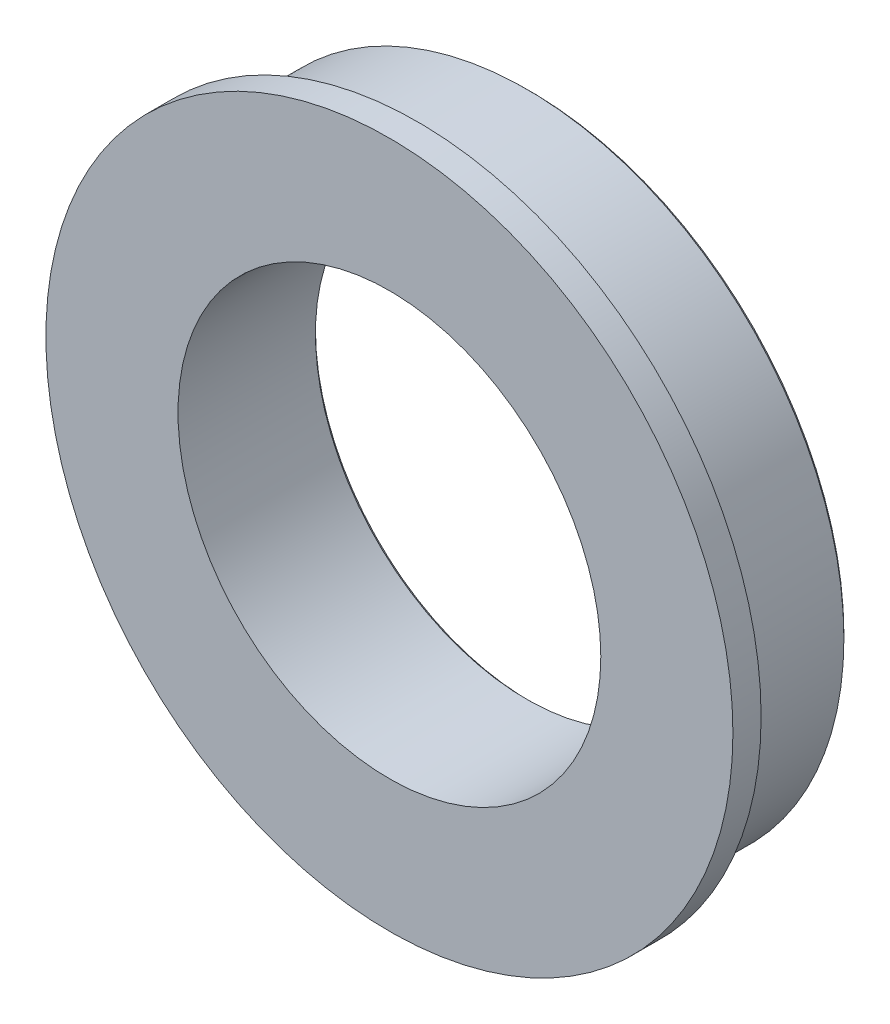
ISO-10303-21;
HEADER;
FILE_DESCRIPTION(('STEP AP214'),'2;1');
FILE_NAME('part.step','',(''),(''),'','','');
FILE_SCHEMA(('AUTOMOTIVE_DESIGN { 1 0 10303 214 1 1 1 1 }'));
ENDSEC;
DATA;
#1=APPLICATION_CONTEXT('core data for automotive mechanical design processes');
#2=APPLICATION_PROTOCOL_DEFINITION('international standard','automotive_design',2000,#1);
#3=PRODUCT_CONTEXT('',#1,'mechanical');
#4=PRODUCT('Part','Part','',(#3));
#5=PRODUCT_RELATED_PRODUCT_CATEGORY('part','',(#4));
#6=PRODUCT_DEFINITION_FORMATION('','',#4);
#7=PRODUCT_DEFINITION_CONTEXT('part definition',#1,'design');
#8=PRODUCT_DEFINITION('design','',#6,#7);
#9=PRODUCT_DEFINITION_SHAPE('','',#8);
#10=(LENGTH_UNIT() NAMED_UNIT(*) SI_UNIT(.MILLI.,.METRE.));
#11=(NAMED_UNIT(*) PLANE_ANGLE_UNIT() SI_UNIT($,.RADIAN.));
#12=(NAMED_UNIT(*) SI_UNIT($,.STERADIAN.) SOLID_ANGLE_UNIT());
#13=UNCERTAINTY_MEASURE_WITH_UNIT(LENGTH_MEASURE(1.E-05),#10,'distance_accuracy_value','');
#14=(GEOMETRIC_REPRESENTATION_CONTEXT(3) GLOBAL_UNCERTAINTY_ASSIGNED_CONTEXT((#13)) GLOBAL_UNIT_ASSIGNED_CONTEXT((#10,
#11,#12)) REPRESENTATION_CONTEXT('',''));
#15=CARTESIAN_POINT('',(0.,0.,0.));
#16=DIRECTION('',(0.,0.,1.));
#17=DIRECTION('',(1.,0.,0.));
#18=AXIS2_PLACEMENT_3D('',#15,#16,#17);
#19=CARTESIAN_POINT('',(0.,0.,4.));
#20=DIRECTION('',(0.,0.,-1.));
#21=DIRECTION('',(-1.,0.,0.));
#22=AXIS2_PLACEMENT_3D('',#19,#20,#21);
#23=CYLINDRICAL_SURFACE('',#22,9.);
#24=CARTESIAN_POINT('',(0.,0.,0.0999999999999977));
#25=DIRECTION('',(0.,0.,1.));
#26=DIRECTION('',(1.,0.,0.));
#27=AXIS2_PLACEMENT_3D('',#24,#25,#26);
#28=CIRCLE('',#27,9.);
#29=CARTESIAN_POINT('',(9.,0.,0.0999999999999977));
#30=VERTEX_POINT('',#29);
#31=EDGE_CURVE('E46',#30,#30,#28,.T.);
#32=ORIENTED_EDGE('',*,*,#31,.T.);
#33=EDGE_LOOP('',(#32));
#34=FACE_BOUND('',#33,.T.);
#35=CARTESIAN_POINT('',(0.,0.,3.2));
#36=DIRECTION('',(0.,0.,1.));
#37=DIRECTION('',(1.,0.,0.));
#38=AXIS2_PLACEMENT_3D('',#35,#36,#37);
#39=CIRCLE('',#38,9.);
#40=CARTESIAN_POINT('',(9.,0.,3.2));
#41=VERTEX_POINT('',#40);
#42=EDGE_CURVE('E10',#41,#41,#39,.T.);
#43=ORIENTED_EDGE('',*,*,#42,.F.);
#44=EDGE_LOOP('',(#43));
#45=FACE_BOUND('',#44,.T.);
#46=ADVANCED_FACE('F41',(#34,#45),#23,.T.);
#47=CARTESIAN_POINT('',(0.,0.,4.));
#48=DIRECTION('',(0.,0.,1.));
#49=DIRECTION('',(1.,0.,0.));
#50=AXIS2_PLACEMENT_3D('',#47,#48,#49);
#51=PLANE('',#50);
#52=CARTESIAN_POINT('',(0.,0.,4.));
#53=DIRECTION('',(0.,0.,1.));
#54=DIRECTION('',(1.,0.,0.));
#55=AXIS2_PLACEMENT_3D('',#52,#53,#54);
#56=CIRCLE('',#55,6.);
#57=CARTESIAN_POINT('',(6.,0.,4.));
#58=VERTEX_POINT('',#57);
#59=EDGE_CURVE('E59',#58,#58,#56,.T.);
#60=ORIENTED_EDGE('',*,*,#59,.F.);
#61=EDGE_LOOP('',(#60));
#62=FACE_BOUND('',#61,.T.);
#63=CARTESIAN_POINT('',(0.,0.,4.));
#64=DIRECTION('',(0.,0.,1.));
#65=DIRECTION('',(1.,0.,0.));
#66=AXIS2_PLACEMENT_3D('',#63,#64,#65);
#67=CIRCLE('',#66,9.75);
#68=CARTESIAN_POINT('',(9.75,0.,4.));
#69=VERTEX_POINT('',#68);
#70=EDGE_CURVE('E57',#69,#69,#67,.T.);
#71=ORIENTED_EDGE('',*,*,#70,.T.);
#72=EDGE_LOOP('',(#71));
#73=FACE_BOUND('',#72,.T.);
#74=ADVANCED_FACE('F81',(#62,#73),#51,.T.);
#75=CARTESIAN_POINT('',(0.,0.,0.));
#76=DIRECTION('',(0.,0.,1.));
#77=DIRECTION('',(1.,0.,0.));
#78=AXIS2_PLACEMENT_3D('',#75,#76,#77);
#79=PLANE('',#78);
#80=CARTESIAN_POINT('',(0.,0.,0.));
#81=DIRECTION('',(0.,0.,1.));
#82=DIRECTION('',(1.,0.,0.));
#83=AXIS2_PLACEMENT_3D('',#80,#81,#82);
#84=CIRCLE('',#83,6.10000000000001);
#85=CARTESIAN_POINT('',(6.10000000000001,0.,0.));
#86=VERTEX_POINT('',#85);
#87=EDGE_CURVE('E66',#86,#86,#84,.T.);
#88=ORIENTED_EDGE('',*,*,#87,.T.);
#89=EDGE_LOOP('',(#88));
#90=FACE_BOUND('',#89,.T.);
#91=CARTESIAN_POINT('',(0.,0.,0.));
#92=DIRECTION('',(0.,0.,1.));
#93=DIRECTION('',(1.,0.,0.));
#94=AXIS2_PLACEMENT_3D('',#91,#92,#93);
#95=CIRCLE('',#94,8.9);
#96=CARTESIAN_POINT('',(8.9,0.,0.));
#97=VERTEX_POINT('',#96);
#98=EDGE_CURVE('E62',#97,#97,#95,.F.);
#99=ORIENTED_EDGE('',*,*,#98,.T.);
#100=EDGE_LOOP('',(#99));
#101=FACE_BOUND('',#100,.T.);
#102=ADVANCED_FACE('F78',(#90,#101),#79,.F.);
#103=CARTESIAN_POINT('',(0.,0.,4.));
#104=DIRECTION('',(0.,0.,-1.));
#105=DIRECTION('',(-1.,0.,0.));
#106=AXIS2_PLACEMENT_3D('',#103,#104,#105);
#107=CYLINDRICAL_SURFACE('',#106,6.);
#108=ORIENTED_EDGE('',*,*,#59,.T.);
#109=EDGE_LOOP('',(#108));
#110=FACE_BOUND('',#109,.T.);
#111=CARTESIAN_POINT('',(0.,0.,0.100000000000006));
#112=DIRECTION('',(0.,0.,1.));
#113=DIRECTION('',(1.,0.,0.));
#114=AXIS2_PLACEMENT_3D('',#111,#112,#113);
#115=CIRCLE('',#114,6.);
#116=CARTESIAN_POINT('',(6.,0.,0.100000000000006));
#117=VERTEX_POINT('',#116);
#118=EDGE_CURVE('E54',#117,#117,#115,.F.);
#119=ORIENTED_EDGE('',*,*,#118,.T.);
#120=EDGE_LOOP('',(#119));
#121=FACE_BOUND('',#120,.T.);
#122=ADVANCED_FACE('F71',(#110,#121),#107,.F.);
#123=CARTESIAN_POINT('',(0.,0.,0.));
#124=DIRECTION('',(0.,0.,-1.));
#125=DIRECTION('',(-1.,0.,0.));
#126=AXIS2_PLACEMENT_3D('',#123,#124,#125);
#127=CONICAL_SURFACE('',#126,6.10000000000001,0.785398163397444);
#128=ORIENTED_EDGE('',*,*,#118,.F.);
#129=EDGE_LOOP('',(#128));
#130=FACE_BOUND('',#129,.T.);
#131=ORIENTED_EDGE('',*,*,#87,.F.);
#132=EDGE_LOOP('',(#131));
#133=FACE_BOUND('',#132,.T.);
#134=ADVANCED_FACE('F73',(#130,#133),#127,.F.);
#135=CARTESIAN_POINT('',(0.,0.,0.0999999999999977));
#136=DIRECTION('',(0.,0.,1.));
#137=DIRECTION('',(1.,0.,0.));
#138=AXIS2_PLACEMENT_3D('',#135,#136,#137);
#139=CONICAL_SURFACE('',#138,9.,0.785398163397448);
#140=ORIENTED_EDGE('',*,*,#98,.F.);
#141=EDGE_LOOP('',(#140));
#142=FACE_BOUND('',#141,.T.);
#143=ORIENTED_EDGE('',*,*,#31,.F.);
#144=EDGE_LOOP('',(#143));
#145=FACE_BOUND('',#144,.T.);
#146=ADVANCED_FACE('F44',(#142,#145),#139,.T.);
#147=CARTESIAN_POINT('',(0.,0.,3.2));
#148=DIRECTION('',(0.,0.,1.));
#149=DIRECTION('',(1.,0.,0.));
#150=AXIS2_PLACEMENT_3D('',#147,#148,#149);
#151=PLANE('',#150);
#152=CARTESIAN_POINT('',(0.,0.,3.2));
#153=DIRECTION('',(0.,0.,1.));
#154=DIRECTION('',(1.,0.,0.));
#155=AXIS2_PLACEMENT_3D('',#152,#153,#154);
#156=CIRCLE('',#155,9.75);
#157=CARTESIAN_POINT('',(9.75,0.,3.2));
#158=VERTEX_POINT('',#157);
#159=EDGE_CURVE('E63',#158,#158,#156,.T.);
#160=ORIENTED_EDGE('',*,*,#159,.F.);
#161=EDGE_LOOP('',(#160));
#162=FACE_BOUND('',#161,.T.);
#163=ORIENTED_EDGE('',*,*,#42,.T.);
#164=EDGE_LOOP('',(#163));
#165=FACE_BOUND('',#164,.T.);
#166=ADVANCED_FACE('F87',(#162,#165),#151,.F.);
#167=CARTESIAN_POINT('',(0.,0.,3.2));
#168=DIRECTION('',(0.,0.,1.));
#169=DIRECTION('',(1.,0.,0.));
#170=AXIS2_PLACEMENT_3D('',#167,#168,#169);
#171=CYLINDRICAL_SURFACE('',#170,9.75);
#172=ORIENTED_EDGE('',*,*,#159,.T.);
#173=EDGE_LOOP('',(#172));
#174=FACE_BOUND('',#173,.T.);
#175=ORIENTED_EDGE('',*,*,#70,.F.);
#176=EDGE_LOOP('',(#175));
#177=FACE_BOUND('',#176,.T.);
#178=ADVANCED_FACE('F107',(#174,#177),#171,.T.);
#179=CLOSED_SHELL('',(#46,#74,#102,#122,#134,#146,#166,#178));
#180=MANIFOLD_SOLID_BREP('B2',#179);
#181=ADVANCED_BREP_SHAPE_REPRESENTATION('',(#18,#180),#14);
#182=SHAPE_DEFINITION_REPRESENTATION(#9,#181);
ENDSEC;
END-ISO-10303-21;
